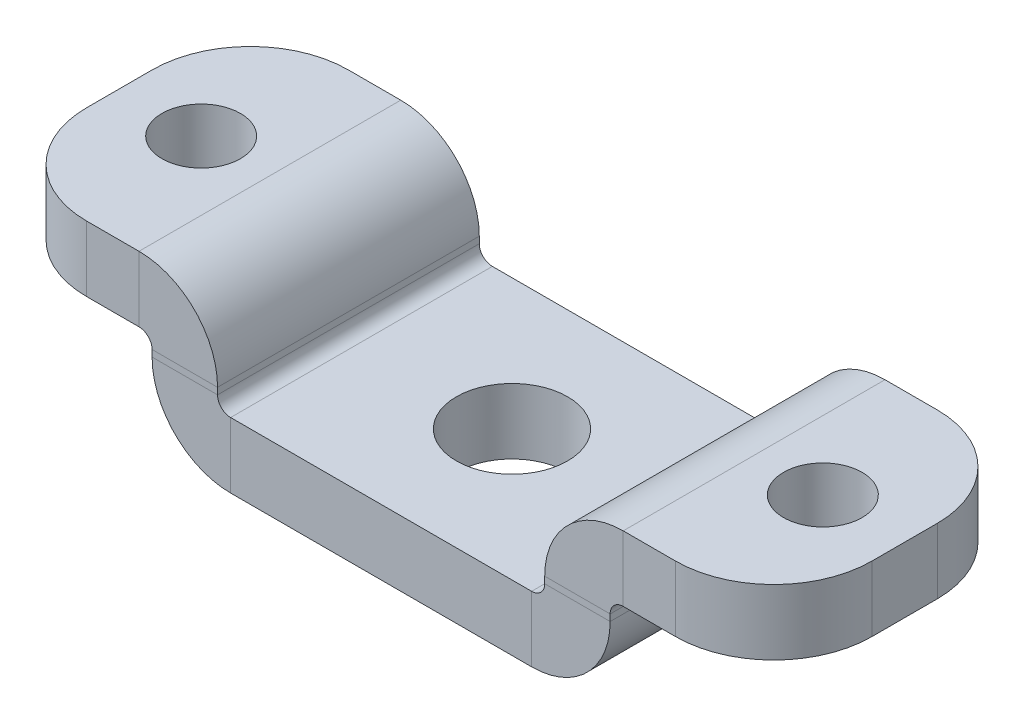
ISO-10303-21;
HEADER;
FILE_DESCRIPTION(('STEP AP214'),'2;1');
FILE_NAME('part.step','',(''),(''),'','','');
FILE_SCHEMA(('AUTOMOTIVE_DESIGN { 1 0 10303 214 1 1 1 1 }'));
ENDSEC;
DATA;
#1=APPLICATION_CONTEXT('core data for automotive mechanical design processes');
#2=APPLICATION_PROTOCOL_DEFINITION('international standard','automotive_design',2000,#1);
#3=PRODUCT_CONTEXT('',#1,'mechanical');
#4=PRODUCT('Part','Part','',(#3));
#5=PRODUCT_RELATED_PRODUCT_CATEGORY('part','',(#4));
#6=PRODUCT_DEFINITION_FORMATION('','',#4);
#7=PRODUCT_DEFINITION_CONTEXT('part definition',#1,'design');
#8=PRODUCT_DEFINITION('design','',#6,#7);
#9=PRODUCT_DEFINITION_SHAPE('','',#8);
#10=(LENGTH_UNIT() NAMED_UNIT(*) SI_UNIT(.MILLI.,.METRE.));
#11=(NAMED_UNIT(*) PLANE_ANGLE_UNIT() SI_UNIT($,.RADIAN.));
#12=(NAMED_UNIT(*) SI_UNIT($,.STERADIAN.) SOLID_ANGLE_UNIT());
#13=UNCERTAINTY_MEASURE_WITH_UNIT(LENGTH_MEASURE(1.E-05),#10,'distance_accuracy_value','');
#14=(GEOMETRIC_REPRESENTATION_CONTEXT(3) GLOBAL_UNCERTAINTY_ASSIGNED_CONTEXT((#13)) GLOBAL_UNIT_ASSIGNED_CONTEXT((#10,
#11,#12)) REPRESENTATION_CONTEXT('',''));
#15=CARTESIAN_POINT('',(0.,0.,0.));
#16=DIRECTION('',(0.,0.,1.));
#17=DIRECTION('',(1.,0.,0.));
#18=AXIS2_PLACEMENT_3D('',#15,#16,#17);
#19=CARTESIAN_POINT('',(7.,0.999999999999993,4.));
#20=DIRECTION('',(0.,0.,-1.));
#21=DIRECTION('',(-1.,0.,0.));
#22=AXIS2_PLACEMENT_3D('',#19,#20,#21);
#23=PLANE('',#22);
#24=DIRECTION('',(-1.,0.,0.));
#25=VECTOR('',#24,1.);
#26=CARTESIAN_POINT('',(7.,1.6,4.));
#27=LINE('',#26,#25);
#28=CARTESIAN_POINT('',(7.,1.6,4.));
#29=VERTEX_POINT('',#28);
#30=CARTESIAN_POINT('',(5.,1.60000000000001,4.));
#31=VERTEX_POINT('',#30);
#32=EDGE_CURVE('E340',#29,#31,#27,.T.);
#33=ORIENTED_EDGE('',*,*,#32,.T.);
#34=DIRECTION('',(0.,1.,0.));
#35=VECTOR('',#34,1.);
#36=CARTESIAN_POINT('',(5.,1.,4.));
#37=LINE('',#36,#35);
#38=CARTESIAN_POINT('',(5.,1.4,4.));
#39=VERTEX_POINT('',#38);
#40=EDGE_CURVE('E408',#31,#39,#37,.F.);
#41=ORIENTED_EDGE('',*,*,#40,.T.);
#42=DIRECTION('',(-1.,0.,0.));
#43=VECTOR('',#42,1.);
#44=CARTESIAN_POINT('',(7.,1.39999999999999,4.));
#45=LINE('',#44,#43);
#46=CARTESIAN_POINT('',(7.,1.39999999999999,4.));
#47=VERTEX_POINT('',#46);
#48=EDGE_CURVE('E396',#39,#47,#45,.F.);
#49=ORIENTED_EDGE('',*,*,#48,.T.);
#50=DIRECTION('',(0.,-1.,0.));
#51=VECTOR('',#50,1.);
#52=CARTESIAN_POINT('',(7.,0.,4.));
#53=LINE('',#52,#51);
#54=EDGE_CURVE('E403',#29,#47,#53,.T.);
#55=ORIENTED_EDGE('',*,*,#54,.F.);
#56=EDGE_LOOP('',(#33,#41,#49,#55));
#57=FACE_BOUND('',#56,.T.);
#58=ADVANCED_FACE('F121',(#57),#23,.F.);
#59=CARTESIAN_POINT('',(7.00000000000001,4.,-4.));
#60=DIRECTION('',(0.,0.,1.));
#61=DIRECTION('',(1.,0.,0.));
#62=AXIS2_PLACEMENT_3D('',#59,#60,#61);
#63=PLANE('',#62);
#64=DIRECTION('',(-1.,0.,0.));
#65=VECTOR('',#64,1.);
#66=CARTESIAN_POINT('',(7.,1.6,-4.));
#67=LINE('',#66,#65);
#68=CARTESIAN_POINT('',(7.,1.6,-4.));
#69=VERTEX_POINT('',#68);
#70=CARTESIAN_POINT('',(5.,1.6,-4.));
#71=VERTEX_POINT('',#70);
#72=EDGE_CURVE('E347',#69,#71,#67,.T.);
#73=ORIENTED_EDGE('',*,*,#72,.F.);
#74=DIRECTION('',(0.,1.,0.));
#75=VECTOR('',#74,1.);
#76=CARTESIAN_POINT('',(7.,0.,-4.));
#77=LINE('',#76,#75);
#78=CARTESIAN_POINT('',(7.,1.39999999999999,-4.));
#79=VERTEX_POINT('',#78);
#80=EDGE_CURVE('E399',#79,#69,#77,.T.);
#81=ORIENTED_EDGE('',*,*,#80,.F.);
#82=DIRECTION('',(-1.,0.,0.));
#83=VECTOR('',#82,1.);
#84=CARTESIAN_POINT('',(5.,1.4,-4.));
#85=LINE('',#84,#83);
#86=CARTESIAN_POINT('',(5.,1.4,-4.));
#87=VERTEX_POINT('',#86);
#88=EDGE_CURVE('E413',#87,#79,#85,.F.);
#89=ORIENTED_EDGE('',*,*,#88,.F.);
#90=DIRECTION('',(0.,-1.,0.));
#91=VECTOR('',#90,1.);
#92=CARTESIAN_POINT('',(5.00000000000001,4.00000000000001,-4.));
#93=LINE('',#92,#91);
#94=EDGE_CURVE('E405',#87,#71,#93,.F.);
#95=ORIENTED_EDGE('',*,*,#94,.T.);
#96=EDGE_LOOP('',(#73,#81,#89,#95));
#97=FACE_BOUND('',#96,.T.);
#98=ADVANCED_FACE('F611',(#97),#63,.F.);
#99=CARTESIAN_POINT('',(7.,0.,0.));
#100=DIRECTION('',(-1.,0.,0.));
#101=DIRECTION('',(0.,-1.,0.));
#102=AXIS2_PLACEMENT_3D('',#99,#100,#101);
#103=PLANE('',#102);
#104=DIRECTION('',(0.,0.,1.));
#105=VECTOR('',#104,1.);
#106=CARTESIAN_POINT('',(7.,1.6,4.));
#107=LINE('',#106,#105);
#108=EDGE_CURVE('E344',#29,#69,#107,.F.);
#109=ORIENTED_EDGE('',*,*,#108,.F.);
#110=ORIENTED_EDGE('',*,*,#54,.T.);
#111=DIRECTION('',(0.,0.,-1.));
#112=VECTOR('',#111,1.);
#113=CARTESIAN_POINT('',(7.,1.39999999999999,4.));
#114=LINE('',#113,#112);
#115=EDGE_CURVE('E410',#79,#47,#114,.F.);
#116=ORIENTED_EDGE('',*,*,#115,.F.);
#117=ORIENTED_EDGE('',*,*,#80,.T.);
#118=EDGE_LOOP('',(#109,#110,#116,#117));
#119=FACE_BOUND('',#118,.T.);
#120=ADVANCED_FACE('F608',(#119),#103,.F.);
#121=CARTESIAN_POINT('',(5.,0.,0.));
#122=DIRECTION('',(-1.,0.,0.));
#123=DIRECTION('',(0.,-1.,0.));
#124=AXIS2_PLACEMENT_3D('',#121,#122,#123);
#125=PLANE('',#124);
#126=ORIENTED_EDGE('',*,*,#40,.F.);
#127=DIRECTION('',(0.,0.,1.));
#128=VECTOR('',#127,1.);
#129=CARTESIAN_POINT('',(5.,1.60000000000001,4.));
#130=LINE('',#129,#128);
#131=EDGE_CURVE('E292',#31,#71,#130,.F.);
#132=ORIENTED_EDGE('',*,*,#131,.T.);
#133=ORIENTED_EDGE('',*,*,#94,.F.);
#134=DIRECTION('',(0.,0.,-1.));
#135=VECTOR('',#134,1.);
#136=CARTESIAN_POINT('',(5.,1.4,4.));
#137=LINE('',#136,#135);
#138=EDGE_CURVE('E416',#39,#87,#137,.T.);
#139=ORIENTED_EDGE('',*,*,#138,.F.);
#140=EDGE_LOOP('',(#126,#132,#133,#139));
#141=FACE_BOUND('',#140,.T.);
#142=ADVANCED_FACE('F618',(#141),#125,.T.);
#143=CARTESIAN_POINT('',(-7.,0.999999999999993,-4.));
#144=DIRECTION('',(0.,0.,1.));
#145=DIRECTION('',(0.,-1.,0.));
#146=AXIS2_PLACEMENT_3D('',#143,#144,#145);
#147=PLANE('',#146);
#148=DIRECTION('',(1.,0.,0.));
#149=VECTOR('',#148,1.);
#150=CARTESIAN_POINT('',(-7.,1.6,-4.));
#151=LINE('',#150,#149);
#152=CARTESIAN_POINT('',(-7.,1.6,-4.));
#153=VERTEX_POINT('',#152);
#154=CARTESIAN_POINT('',(-5.,1.60000000000001,-4.));
#155=VERTEX_POINT('',#154);
#156=EDGE_CURVE('E383',#153,#155,#151,.T.);
#157=ORIENTED_EDGE('',*,*,#156,.T.);
#158=DIRECTION('',(0.,1.,0.));
#159=VECTOR('',#158,1.);
#160=CARTESIAN_POINT('',(-5.,1.,-4.));
#161=LINE('',#160,#159);
#162=CARTESIAN_POINT('',(-5.,1.4,-4.));
#163=VERTEX_POINT('',#162);
#164=EDGE_CURVE('E452',#155,#163,#161,.F.);
#165=ORIENTED_EDGE('',*,*,#164,.T.);
#166=DIRECTION('',(1.,0.,0.));
#167=VECTOR('',#166,1.);
#168=CARTESIAN_POINT('',(-7.,1.39999999999999,-4.));
#169=LINE('',#168,#167);
#170=CARTESIAN_POINT('',(-7.,1.39999999999999,-4.));
#171=VERTEX_POINT('',#170);
#172=EDGE_CURVE('E440',#163,#171,#169,.F.);
#173=ORIENTED_EDGE('',*,*,#172,.T.);
#174=DIRECTION('',(0.,-1.,0.));
#175=VECTOR('',#174,1.);
#176=CARTESIAN_POINT('',(-7.,0.,-4.));
#177=LINE('',#176,#175);
#178=EDGE_CURVE('E447',#153,#171,#177,.T.);
#179=ORIENTED_EDGE('',*,*,#178,.F.);
#180=EDGE_LOOP('',(#157,#165,#173,#179));
#181=FACE_BOUND('',#180,.T.);
#182=ADVANCED_FACE('F577',(#181),#147,.F.);
#183=CARTESIAN_POINT('',(-7.00000000000001,4.,4.));
#184=DIRECTION('',(0.,0.,-1.));
#185=DIRECTION('',(0.,1.,0.));
#186=AXIS2_PLACEMENT_3D('',#183,#184,#185);
#187=PLANE('',#186);
#188=DIRECTION('',(1.,0.,0.));
#189=VECTOR('',#188,1.);
#190=CARTESIAN_POINT('',(-7.,1.6,4.));
#191=LINE('',#190,#189);
#192=CARTESIAN_POINT('',(-7.,1.6,4.));
#193=VERTEX_POINT('',#192);
#194=CARTESIAN_POINT('',(-5.,1.6,4.));
#195=VERTEX_POINT('',#194);
#196=EDGE_CURVE('E393',#193,#195,#191,.T.);
#197=ORIENTED_EDGE('',*,*,#196,.F.);
#198=DIRECTION('',(0.,1.,0.));
#199=VECTOR('',#198,1.);
#200=CARTESIAN_POINT('',(-6.99999999999999,0.,4.));
#201=LINE('',#200,#199);
#202=CARTESIAN_POINT('',(-7.,1.39999999999999,4.));
#203=VERTEX_POINT('',#202);
#204=EDGE_CURVE('E443',#203,#193,#201,.T.);
#205=ORIENTED_EDGE('',*,*,#204,.F.);
#206=DIRECTION('',(1.,0.,0.));
#207=VECTOR('',#206,1.);
#208=CARTESIAN_POINT('',(-5.,1.4,4.));
#209=LINE('',#208,#207);
#210=CARTESIAN_POINT('',(-5.,1.4,4.));
#211=VERTEX_POINT('',#210);
#212=EDGE_CURVE('E457',#211,#203,#209,.F.);
#213=ORIENTED_EDGE('',*,*,#212,.F.);
#214=DIRECTION('',(0.,-1.,0.));
#215=VECTOR('',#214,1.);
#216=CARTESIAN_POINT('',(-5.00000000000001,4.00000000000001,4.));
#217=LINE('',#216,#215);
#218=EDGE_CURVE('E449',#211,#195,#217,.F.);
#219=ORIENTED_EDGE('',*,*,#218,.T.);
#220=EDGE_LOOP('',(#197,#205,#213,#219));
#221=FACE_BOUND('',#220,.T.);
#222=ADVANCED_FACE('F560',(#221),#187,.F.);
#223=CARTESIAN_POINT('',(-7.,0.,0.));
#224=DIRECTION('',(1.,0.,0.));
#225=DIRECTION('',(0.,1.,0.));
#226=AXIS2_PLACEMENT_3D('',#223,#224,#225);
#227=PLANE('',#226);
#228=DIRECTION('',(0.,0.,-1.));
#229=VECTOR('',#228,1.);
#230=CARTESIAN_POINT('',(-7.,1.6,-4.));
#231=LINE('',#230,#229);
#232=EDGE_CURVE('E389',#153,#193,#231,.F.);
#233=ORIENTED_EDGE('',*,*,#232,.F.);
#234=ORIENTED_EDGE('',*,*,#178,.T.);
#235=DIRECTION('',(0.,0.,1.));
#236=VECTOR('',#235,1.);
#237=CARTESIAN_POINT('',(-7.,1.39999999999999,-4.));
#238=LINE('',#237,#236);
#239=EDGE_CURVE('E454',#203,#171,#238,.F.);
#240=ORIENTED_EDGE('',*,*,#239,.F.);
#241=ORIENTED_EDGE('',*,*,#204,.T.);
#242=EDGE_LOOP('',(#233,#234,#240,#241));
#243=FACE_BOUND('',#242,.T.);
#244=ADVANCED_FACE('F565',(#243),#227,.F.);
#245=CARTESIAN_POINT('',(-5.,0.,0.));
#246=DIRECTION('',(1.,0.,0.));
#247=DIRECTION('',(0.,1.,0.));
#248=AXIS2_PLACEMENT_3D('',#245,#246,#247);
#249=PLANE('',#248);
#250=ORIENTED_EDGE('',*,*,#164,.F.);
#251=DIRECTION('',(0.,0.,-1.));
#252=VECTOR('',#251,1.);
#253=CARTESIAN_POINT('',(-5.,1.60000000000001,-4.));
#254=LINE('',#253,#252);
#255=EDGE_CURVE('E376',#155,#195,#254,.F.);
#256=ORIENTED_EDGE('',*,*,#255,.T.);
#257=ORIENTED_EDGE('',*,*,#218,.F.);
#258=DIRECTION('',(0.,0.,1.));
#259=VECTOR('',#258,1.);
#260=CARTESIAN_POINT('',(-5.,1.4,-4.));
#261=LINE('',#260,#259);
#262=EDGE_CURVE('E460',#163,#211,#261,.T.);
#263=ORIENTED_EDGE('',*,*,#262,.F.);
#264=EDGE_LOOP('',(#250,#256,#257,#263));
#265=FACE_BOUND('',#264,.T.);
#266=ADVANCED_FACE('F581',(#265),#249,.T.);
#267=CARTESIAN_POINT('',(0.,-1.,0.));
#268=DIRECTION('',(0.,1.,0.));
#269=DIRECTION('',(0.,0.,1.));
#270=AXIS2_PLACEMENT_3D('',#267,#268,#269);
#271=PLANE('',#270);
#272=CARTESIAN_POINT('',(0.,-1.,0.));
#273=DIRECTION('',(0.,-1.,0.));
#274=DIRECTION('',(0.,0.,-1.));
#275=AXIS2_PLACEMENT_3D('',#272,#273,#274);
#276=CIRCLE('',#275,1.69999999999999);
#277=CARTESIAN_POINT('',(0.,-1.,-1.69999999999999));
#278=VERTEX_POINT('',#277);
#279=EDGE_CURVE('E680',#278,#278,#276,.T.);
#280=ORIENTED_EDGE('',*,*,#279,.F.);
#281=EDGE_LOOP('',(#280));
#282=FACE_BOUND('',#281,.T.);
#283=DIRECTION('',(0.,0.,-1.));
#284=VECTOR('',#283,1.);
#285=CARTESIAN_POINT('',(4.6,-1.,-4.));
#286=LINE('',#285,#284);
#287=CARTESIAN_POINT('',(4.6,-1.,-4.));
#288=VERTEX_POINT('',#287);
#289=CARTESIAN_POINT('',(4.6,-1.,4.));
#290=VERTEX_POINT('',#289);
#291=EDGE_CURVE('E420',#288,#290,#286,.F.);
#292=ORIENTED_EDGE('',*,*,#291,.T.);
#293=DIRECTION('',(1.,0.,0.));
#294=VECTOR('',#293,1.);
#295=CARTESIAN_POINT('',(-7.,-1.,4.));
#296=LINE('',#295,#294);
#297=CARTESIAN_POINT('',(-4.59999999999999,-1.,4.));
#298=VERTEX_POINT('',#297);
#299=EDGE_CURVE('E490',#298,#290,#296,.T.);
#300=ORIENTED_EDGE('',*,*,#299,.F.);
#301=DIRECTION('',(0.,0.,1.));
#302=VECTOR('',#301,1.);
#303=CARTESIAN_POINT('',(-4.59999999999999,-1.,4.));
#304=LINE('',#303,#302);
#305=CARTESIAN_POINT('',(-4.6,-1.,-4.));
#306=VERTEX_POINT('',#305);
#307=EDGE_CURVE('E464',#298,#306,#304,.F.);
#308=ORIENTED_EDGE('',*,*,#307,.T.);
#309=DIRECTION('',(-1.,0.,0.));
#310=VECTOR('',#309,1.);
#311=CARTESIAN_POINT('',(-7.,-1.,-4.));
#312=LINE('',#311,#310);
#313=EDGE_CURVE('E488',#288,#306,#312,.T.);
#314=ORIENTED_EDGE('',*,*,#313,.F.);
#315=EDGE_LOOP('',(#292,#300,#308,#314));
#316=FACE_BOUND('',#315,.T.);
#317=ADVANCED_FACE('F592',(#282,#316),#271,.F.);
#318=CARTESIAN_POINT('',(0.,1.,0.));
#319=DIRECTION('',(0.,1.,0.));
#320=DIRECTION('',(0.,0.,1.));
#321=AXIS2_PLACEMENT_3D('',#318,#319,#320);
#322=PLANE('',#321);
#323=CARTESIAN_POINT('',(0.,1.,0.));
#324=DIRECTION('',(0.,1.,0.));
#325=DIRECTION('',(0.,0.,1.));
#326=AXIS2_PLACEMENT_3D('',#323,#324,#325);
#327=CIRCLE('',#326,1.69999999999999);
#328=CARTESIAN_POINT('',(0.,1.,1.69999999999999));
#329=VERTEX_POINT('',#328);
#330=EDGE_CURVE('E337',#329,#329,#327,.T.);
#331=ORIENTED_EDGE('',*,*,#330,.F.);
#332=EDGE_LOOP('',(#331));
#333=FACE_BOUND('',#332,.T.);
#334=DIRECTION('',(1.,0.,0.));
#335=VECTOR('',#334,1.);
#336=CARTESIAN_POINT('',(-7.,1.,4.));
#337=LINE('',#336,#335);
#338=CARTESIAN_POINT('',(-4.6,1.,4.));
#339=VERTEX_POINT('',#338);
#340=CARTESIAN_POINT('',(4.6,0.999999999999999,4.));
#341=VERTEX_POINT('',#340);
#342=EDGE_CURVE('E491',#339,#341,#337,.T.);
#343=ORIENTED_EDGE('',*,*,#342,.T.);
#344=DIRECTION('',(0.,0.,-1.));
#345=VECTOR('',#344,1.);
#346=CARTESIAN_POINT('',(4.6,0.999999999999997,-4.));
#347=LINE('',#346,#345);
#348=CARTESIAN_POINT('',(4.6,0.999999999999997,-4.));
#349=VERTEX_POINT('',#348);
#350=EDGE_CURVE('E432',#349,#341,#347,.F.);
#351=ORIENTED_EDGE('',*,*,#350,.F.);
#352=DIRECTION('',(-1.,0.,0.));
#353=VECTOR('',#352,1.);
#354=CARTESIAN_POINT('',(-7.,1.,-4.));
#355=LINE('',#354,#353);
#356=CARTESIAN_POINT('',(-4.6,1.,-4.));
#357=VERTEX_POINT('',#356);
#358=EDGE_CURVE('E485',#349,#357,#355,.T.);
#359=ORIENTED_EDGE('',*,*,#358,.T.);
#360=DIRECTION('',(0.,0.,1.));
#361=VECTOR('',#360,1.);
#362=CARTESIAN_POINT('',(-4.6,0.999999999999998,4.));
#363=LINE('',#362,#361);
#364=EDGE_CURVE('E477',#339,#357,#363,.F.);
#365=ORIENTED_EDGE('',*,*,#364,.F.);
#366=EDGE_LOOP('',(#343,#351,#359,#365));
#367=FACE_BOUND('',#366,.T.);
#368=ADVANCED_FACE('F629',(#333,#367),#322,.T.);
#369=CARTESIAN_POINT('',(-7.,-1.,-4.));
#370=DIRECTION('',(0.,0.,-1.));
#371=DIRECTION('',(-1.,0.,0.));
#372=AXIS2_PLACEMENT_3D('',#369,#370,#371);
#373=PLANE('',#372);
#374=ORIENTED_EDGE('',*,*,#358,.F.);
#375=DIRECTION('',(0.,-1.,0.));
#376=VECTOR('',#375,1.);
#377=CARTESIAN_POINT('',(4.6,0.999999999999997,-4.));
#378=LINE('',#377,#376);
#379=EDGE_CURVE('E426',#349,#288,#378,.T.);
#380=ORIENTED_EDGE('',*,*,#379,.T.);
#381=ORIENTED_EDGE('',*,*,#313,.T.);
#382=DIRECTION('',(0.,-1.,0.));
#383=VECTOR('',#382,1.);
#384=CARTESIAN_POINT('',(-4.6,1.,-4.));
#385=LINE('',#384,#383);
#386=EDGE_CURVE('E482',#357,#306,#385,.T.);
#387=ORIENTED_EDGE('',*,*,#386,.F.);
#388=EDGE_LOOP('',(#374,#380,#381,#387));
#389=FACE_BOUND('',#388,.T.);
#390=ADVANCED_FACE('F631',(#389),#373,.T.);
#391=CARTESIAN_POINT('',(-7.,-1.,4.));
#392=DIRECTION('',(0.,0.,1.));
#393=DIRECTION('',(1.,0.,0.));
#394=AXIS2_PLACEMENT_3D('',#391,#392,#393);
#395=PLANE('',#394);
#396=DIRECTION('',(0.,-1.,0.));
#397=VECTOR('',#396,1.);
#398=CARTESIAN_POINT('',(4.6,0.999999999999999,4.));
#399=LINE('',#398,#397);
#400=EDGE_CURVE('E437',#341,#290,#399,.T.);
#401=ORIENTED_EDGE('',*,*,#400,.F.);
#402=ORIENTED_EDGE('',*,*,#342,.F.);
#403=DIRECTION('',(0.,-1.,0.));
#404=VECTOR('',#403,1.);
#405=CARTESIAN_POINT('',(-4.6,0.999999999999998,4.));
#406=LINE('',#405,#404);
#407=EDGE_CURVE('E471',#339,#298,#406,.T.);
#408=ORIENTED_EDGE('',*,*,#407,.T.);
#409=ORIENTED_EDGE('',*,*,#299,.T.);
#410=EDGE_LOOP('',(#401,#402,#408,#409));
#411=FACE_BOUND('',#410,.T.);
#412=ADVANCED_FACE('F590',(#411),#395,.T.);
#413=CARTESIAN_POINT('',(-4.6,1.4,-4.));
#414=DIRECTION('',(0.,0.,-1.));
#415=DIRECTION('',(0.,1.,0.));
#416=AXIS2_PLACEMENT_3D('',#413,#414,#415);
#417=PLANE('',#416);
#418=ORIENTED_EDGE('',*,*,#172,.F.);
#419=CARTESIAN_POINT('',(-4.6,1.4,-4.));
#420=DIRECTION('',(0.,0.,1.));
#421=DIRECTION('',(0.,-1.,0.));
#422=AXIS2_PLACEMENT_3D('',#419,#420,#421);
#423=CIRCLE('',#422,0.400000000000001);
#424=EDGE_CURVE('E474',#357,#163,#423,.F.);
#425=ORIENTED_EDGE('',*,*,#424,.F.);
#426=ORIENTED_EDGE('',*,*,#386,.T.);
#427=CARTESIAN_POINT('',(-4.6,1.4,-4.));
#428=DIRECTION('',(0.,0.,1.));
#429=DIRECTION('',(0.,-1.,0.));
#430=AXIS2_PLACEMENT_3D('',#427,#428,#429);
#431=CIRCLE('',#430,2.4);
#432=EDGE_CURVE('E467',#306,#171,#431,.F.);
#433=ORIENTED_EDGE('',*,*,#432,.T.);
#434=EDGE_LOOP('',(#418,#425,#426,#433));
#435=FACE_BOUND('',#434,.T.);
#436=ADVANCED_FACE('F573',(#435),#417,.T.);
#437=CARTESIAN_POINT('',(-4.6,1.4,4.));
#438=DIRECTION('',(0.,0.,-1.));
#439=DIRECTION('',(0.,1.,0.));
#440=AXIS2_PLACEMENT_3D('',#437,#438,#439);
#441=PLANE('',#440);
#442=CARTESIAN_POINT('',(-4.6,1.4,4.));
#443=DIRECTION('',(0.,0.,1.));
#444=DIRECTION('',(0.,-1.,0.));
#445=AXIS2_PLACEMENT_3D('',#442,#443,#444);
#446=CIRCLE('',#445,0.400000000000001);
#447=EDGE_CURVE('E446',#211,#339,#446,.T.);
#448=ORIENTED_EDGE('',*,*,#447,.F.);
#449=ORIENTED_EDGE('',*,*,#212,.T.);
#450=CARTESIAN_POINT('',(-4.6,1.4,4.));
#451=DIRECTION('',(0.,0.,1.));
#452=DIRECTION('',(0.,-1.,0.));
#453=AXIS2_PLACEMENT_3D('',#450,#451,#452);
#454=CIRCLE('',#453,2.4);
#455=EDGE_CURVE('E468',#203,#298,#454,.T.);
#456=ORIENTED_EDGE('',*,*,#455,.T.);
#457=ORIENTED_EDGE('',*,*,#407,.F.);
#458=EDGE_LOOP('',(#448,#449,#456,#457));
#459=FACE_BOUND('',#458,.T.);
#460=ADVANCED_FACE('F587',(#459),#441,.F.);
#461=CARTESIAN_POINT('',(-4.6,1.4,4.));
#462=DIRECTION('',(0.,0.,1.));
#463=DIRECTION('',(-1.,0.,0.));
#464=AXIS2_PLACEMENT_3D('',#461,#462,#463);
#465=CYLINDRICAL_SURFACE('',#464,2.4);
#466=ORIENTED_EDGE('',*,*,#307,.F.);
#467=ORIENTED_EDGE('',*,*,#455,.F.);
#468=ORIENTED_EDGE('',*,*,#239,.T.);
#469=ORIENTED_EDGE('',*,*,#432,.F.);
#470=EDGE_LOOP('',(#466,#467,#468,#469));
#471=FACE_BOUND('',#470,.T.);
#472=ADVANCED_FACE('F570',(#471),#465,.T.);
#473=CARTESIAN_POINT('',(-4.6,1.4,4.));
#474=DIRECTION('',(0.,0.,1.));
#475=DIRECTION('',(-1.,0.,0.));
#476=AXIS2_PLACEMENT_3D('',#473,#474,#475);
#477=CYLINDRICAL_SURFACE('',#476,0.400000000000001);
#478=ORIENTED_EDGE('',*,*,#364,.T.);
#479=ORIENTED_EDGE('',*,*,#424,.T.);
#480=ORIENTED_EDGE('',*,*,#262,.T.);
#481=ORIENTED_EDGE('',*,*,#447,.T.);
#482=EDGE_LOOP('',(#478,#479,#480,#481));
#483=FACE_BOUND('',#482,.T.);
#484=ADVANCED_FACE('F584',(#483),#477,.F.);
#485=CARTESIAN_POINT('',(4.6,1.4,4.));
#486=DIRECTION('',(0.,0.,1.));
#487=DIRECTION('',(0.,-1.,0.));
#488=AXIS2_PLACEMENT_3D('',#485,#486,#487);
#489=PLANE('',#488);
#490=ORIENTED_EDGE('',*,*,#48,.F.);
#491=CARTESIAN_POINT('',(4.6,1.4,4.));
#492=DIRECTION('',(0.,0.,-1.));
#493=DIRECTION('',(0.,1.,0.));
#494=AXIS2_PLACEMENT_3D('',#491,#492,#493);
#495=CIRCLE('',#494,0.400000000000001);
#496=EDGE_CURVE('E429',#341,#39,#495,.F.);
#497=ORIENTED_EDGE('',*,*,#496,.F.);
#498=ORIENTED_EDGE('',*,*,#400,.T.);
#499=CARTESIAN_POINT('',(4.6,1.4,4.));
#500=DIRECTION('',(0.,0.,-1.));
#501=DIRECTION('',(0.,1.,0.));
#502=AXIS2_PLACEMENT_3D('',#499,#500,#501);
#503=CIRCLE('',#502,2.4);
#504=EDGE_CURVE('E422',#290,#47,#503,.F.);
#505=ORIENTED_EDGE('',*,*,#504,.T.);
#506=EDGE_LOOP('',(#490,#497,#498,#505));
#507=FACE_BOUND('',#506,.T.);
#508=ADVANCED_FACE('F624',(#507),#489,.T.);
#509=CARTESIAN_POINT('',(4.6,1.4,-4.));
#510=DIRECTION('',(0.,0.,1.));
#511=DIRECTION('',(0.,-1.,0.));
#512=AXIS2_PLACEMENT_3D('',#509,#510,#511);
#513=PLANE('',#512);
#514=CARTESIAN_POINT('',(4.6,1.4,-4.));
#515=DIRECTION('',(0.,0.,-1.));
#516=DIRECTION('',(0.,1.,0.));
#517=AXIS2_PLACEMENT_3D('',#514,#515,#516);
#518=CIRCLE('',#517,0.400000000000001);
#519=EDGE_CURVE('E402',#87,#349,#518,.T.);
#520=ORIENTED_EDGE('',*,*,#519,.F.);
#521=ORIENTED_EDGE('',*,*,#88,.T.);
#522=CARTESIAN_POINT('',(4.6,1.4,-4.));
#523=DIRECTION('',(0.,0.,-1.));
#524=DIRECTION('',(0.,1.,0.));
#525=AXIS2_PLACEMENT_3D('',#522,#523,#524);
#526=CIRCLE('',#525,2.4);
#527=EDGE_CURVE('E423',#79,#288,#526,.T.);
#528=ORIENTED_EDGE('',*,*,#527,.T.);
#529=ORIENTED_EDGE('',*,*,#379,.F.);
#530=EDGE_LOOP('',(#520,#521,#528,#529));
#531=FACE_BOUND('',#530,.T.);
#532=ADVANCED_FACE('F600',(#531),#513,.F.);
#533=CARTESIAN_POINT('',(4.6,1.4,-4.));
#534=DIRECTION('',(0.,0.,-1.));
#535=DIRECTION('',(1.,0.,0.));
#536=AXIS2_PLACEMENT_3D('',#533,#534,#535);
#537=CYLINDRICAL_SURFACE('',#536,2.4);
#538=ORIENTED_EDGE('',*,*,#291,.F.);
#539=ORIENTED_EDGE('',*,*,#527,.F.);
#540=ORIENTED_EDGE('',*,*,#115,.T.);
#541=ORIENTED_EDGE('',*,*,#504,.F.);
#542=EDGE_LOOP('',(#538,#539,#540,#541));
#543=FACE_BOUND('',#542,.T.);
#544=ADVANCED_FACE('F596',(#543),#537,.T.);
#545=CARTESIAN_POINT('',(4.6,1.4,-4.));
#546=DIRECTION('',(0.,0.,-1.));
#547=DIRECTION('',(1.,0.,0.));
#548=AXIS2_PLACEMENT_3D('',#545,#546,#547);
#549=CYLINDRICAL_SURFACE('',#548,0.400000000000001);
#550=ORIENTED_EDGE('',*,*,#350,.T.);
#551=ORIENTED_EDGE('',*,*,#496,.T.);
#552=ORIENTED_EDGE('',*,*,#138,.T.);
#553=ORIENTED_EDGE('',*,*,#519,.T.);
#554=EDGE_LOOP('',(#550,#551,#552,#553));
#555=FACE_BOUND('',#554,.T.);
#556=ADVANCED_FACE('F626',(#555),#549,.F.);
#557=CARTESIAN_POINT('',(-7.4,1.6,4.));
#558=DIRECTION('',(0.,0.,1.));
#559=DIRECTION('',(1.,0.,0.));
#560=AXIS2_PLACEMENT_3D('',#557,#558,#559);
#561=PLANE('',#560);
#562=DIRECTION('',(0.,-1.,0.));
#563=VECTOR('',#562,1.);
#564=CARTESIAN_POINT('',(-7.4,4.,4.));
#565=LINE('',#564,#563);
#566=CARTESIAN_POINT('',(-7.4,2.,4.));
#567=VERTEX_POINT('',#566);
#568=CARTESIAN_POINT('',(-7.4,4.,4.));
#569=VERTEX_POINT('',#568);
#570=EDGE_CURVE('E350',#567,#569,#565,.F.);
#571=ORIENTED_EDGE('',*,*,#570,.F.);
#572=CARTESIAN_POINT('',(-7.4,1.6,4.));
#573=DIRECTION('',(0.,0.,-1.));
#574=DIRECTION('',(-1.,0.,0.));
#575=AXIS2_PLACEMENT_3D('',#572,#573,#574);
#576=CIRCLE('',#575,0.4);
#577=EDGE_CURVE('E386',#193,#567,#576,.F.);
#578=ORIENTED_EDGE('',*,*,#577,.F.);
#579=ORIENTED_EDGE('',*,*,#196,.T.);
#580=CARTESIAN_POINT('',(-7.4,1.6,4.));
#581=DIRECTION('',(0.,0.,-1.));
#582=DIRECTION('',(-1.,0.,0.));
#583=AXIS2_PLACEMENT_3D('',#580,#581,#582);
#584=CIRCLE('',#583,2.4);
#585=EDGE_CURVE('E379',#195,#569,#584,.F.);
#586=ORIENTED_EDGE('',*,*,#585,.T.);
#587=EDGE_LOOP('',(#571,#578,#579,#586));
#588=FACE_BOUND('',#587,.T.);
#589=ADVANCED_FACE('F548',(#588),#561,.T.);
#590=CARTESIAN_POINT('',(-7.4,1.6,-4.));
#591=DIRECTION('',(0.,0.,1.));
#592=DIRECTION('',(1.,0.,0.));
#593=AXIS2_PLACEMENT_3D('',#590,#591,#592);
#594=PLANE('',#593);
#595=CARTESIAN_POINT('',(-7.4,1.6,-4.));
#596=DIRECTION('',(0.,0.,-1.));
#597=DIRECTION('',(-1.,0.,0.));
#598=AXIS2_PLACEMENT_3D('',#595,#596,#597);
#599=CIRCLE('',#598,0.4);
#600=CARTESIAN_POINT('',(-7.4,2.,-4.));
#601=VERTEX_POINT('',#600);
#602=EDGE_CURVE('E354',#601,#153,#599,.T.);
#603=ORIENTED_EDGE('',*,*,#602,.F.);
#604=DIRECTION('',(0.,-1.,0.));
#605=VECTOR('',#604,1.);
#606=CARTESIAN_POINT('',(-7.4,2.,-4.));
#607=LINE('',#606,#605);
#608=CARTESIAN_POINT('',(-7.4,4.,-4.));
#609=VERTEX_POINT('',#608);
#610=EDGE_CURVE('E369',#601,#609,#607,.F.);
#611=ORIENTED_EDGE('',*,*,#610,.T.);
#612=CARTESIAN_POINT('',(-7.4,1.6,-4.));
#613=DIRECTION('',(0.,0.,-1.));
#614=DIRECTION('',(-1.,0.,0.));
#615=AXIS2_PLACEMENT_3D('',#612,#613,#614);
#616=CIRCLE('',#615,2.4);
#617=EDGE_CURVE('E380',#609,#155,#616,.T.);
#618=ORIENTED_EDGE('',*,*,#617,.T.);
#619=ORIENTED_EDGE('',*,*,#156,.F.);
#620=EDGE_LOOP('',(#603,#611,#618,#619));
#621=FACE_BOUND('',#620,.T.);
#622=ADVANCED_FACE('F543',(#621),#594,.F.);
#623=CARTESIAN_POINT('',(-7.4,1.6,-4.));
#624=DIRECTION('',(0.,0.,-1.));
#625=DIRECTION('',(0.,1.,0.));
#626=AXIS2_PLACEMENT_3D('',#623,#624,#625);
#627=CYLINDRICAL_SURFACE('',#626,2.4);
#628=ORIENTED_EDGE('',*,*,#255,.F.);
#629=ORIENTED_EDGE('',*,*,#617,.F.);
#630=DIRECTION('',(0.,0.,-1.));
#631=VECTOR('',#630,1.);
#632=CARTESIAN_POINT('',(-7.4,4.,4.));
#633=LINE('',#632,#631);
#634=EDGE_CURVE('E366',#609,#569,#633,.F.);
#635=ORIENTED_EDGE('',*,*,#634,.T.);
#636=ORIENTED_EDGE('',*,*,#585,.F.);
#637=EDGE_LOOP('',(#628,#629,#635,#636));
#638=FACE_BOUND('',#637,.T.);
#639=ADVANCED_FACE('F545',(#638),#627,.T.);
#640=CARTESIAN_POINT('',(-7.4,1.6,-4.));
#641=DIRECTION('',(0.,0.,-1.));
#642=DIRECTION('',(0.,1.,0.));
#643=AXIS2_PLACEMENT_3D('',#640,#641,#642);
#644=CYLINDRICAL_SURFACE('',#643,0.4);
#645=ORIENTED_EDGE('',*,*,#232,.T.);
#646=ORIENTED_EDGE('',*,*,#577,.T.);
#647=DIRECTION('',(0.,0.,-1.));
#648=VECTOR('',#647,1.);
#649=CARTESIAN_POINT('',(-7.4,2.,4.));
#650=LINE('',#649,#648);
#651=EDGE_CURVE('E372',#567,#601,#650,.T.);
#652=ORIENTED_EDGE('',*,*,#651,.T.);
#653=ORIENTED_EDGE('',*,*,#602,.T.);
#654=EDGE_LOOP('',(#645,#646,#652,#653));
#655=FACE_BOUND('',#654,.T.);
#656=ADVANCED_FACE('F556',(#655),#644,.F.);
#657=CARTESIAN_POINT('',(-12.,4.,-4.));
#658=DIRECTION('',(0.,0.,1.));
#659=DIRECTION('',(1.,0.,0.));
#660=AXIS2_PLACEMENT_3D('',#657,#658,#659);
#661=PLANE('',#660);
#662=DIRECTION('',(1.,0.,0.));
#663=VECTOR('',#662,1.);
#664=CARTESIAN_POINT('',(-12.,2.,-4.));
#665=LINE('',#664,#663);
#666=CARTESIAN_POINT('',(-9.00000000000001,2.,-4.));
#667=VERTEX_POINT('',#666);
#668=EDGE_CURVE('E364',#601,#667,#665,.F.);
#669=ORIENTED_EDGE('',*,*,#668,.T.);
#670=DIRECTION('',(0.,-1.,0.));
#671=VECTOR('',#670,1.);
#672=CARTESIAN_POINT('',(-9.00000000000001,4.,-4.));
#673=LINE('',#672,#671);
#674=CARTESIAN_POINT('',(-9.00000000000001,4.,-4.));
#675=VERTEX_POINT('',#674);
#676=EDGE_CURVE('E144',#667,#675,#673,.F.);
#677=ORIENTED_EDGE('',*,*,#676,.T.);
#678=DIRECTION('',(-1.,0.,0.));
#679=VECTOR('',#678,1.);
#680=CARTESIAN_POINT('',(0.,4.,-4.));
#681=LINE('',#680,#679);
#682=EDGE_CURVE('E357',#609,#675,#681,.T.);
#683=ORIENTED_EDGE('',*,*,#682,.F.);
#684=ORIENTED_EDGE('',*,*,#610,.F.);
#685=EDGE_LOOP('',(#669,#677,#683,#684));
#686=FACE_BOUND('',#685,.T.);
#687=ADVANCED_FACE('F540',(#686),#661,.F.);
#688=CARTESIAN_POINT('',(-7.,4.,4.));
#689=DIRECTION('',(0.,0.,-1.));
#690=DIRECTION('',(-1.,0.,0.));
#691=AXIS2_PLACEMENT_3D('',#688,#689,#690);
#692=PLANE('',#691);
#693=DIRECTION('',(1.,0.,0.));
#694=VECTOR('',#693,1.);
#695=CARTESIAN_POINT('',(0.,4.,4.));
#696=LINE('',#695,#694);
#697=CARTESIAN_POINT('',(-9.00000000000001,4.,4.));
#698=VERTEX_POINT('',#697);
#699=EDGE_CURVE('E352',#698,#569,#696,.T.);
#700=ORIENTED_EDGE('',*,*,#699,.F.);
#701=DIRECTION('',(0.,-1.,0.));
#702=VECTOR('',#701,1.);
#703=CARTESIAN_POINT('',(-9.00000000000001,4.,4.));
#704=LINE('',#703,#702);
#705=CARTESIAN_POINT('',(-9.00000000000001,2.,4.));
#706=VERTEX_POINT('',#705);
#707=EDGE_CURVE('E13',#698,#706,#704,.T.);
#708=ORIENTED_EDGE('',*,*,#707,.T.);
#709=DIRECTION('',(-1.,0.,0.));
#710=VECTOR('',#709,1.);
#711=CARTESIAN_POINT('',(-7.,2.,4.));
#712=LINE('',#711,#710);
#713=EDGE_CURVE('E359',#706,#567,#712,.F.);
#714=ORIENTED_EDGE('',*,*,#713,.T.);
#715=ORIENTED_EDGE('',*,*,#570,.T.);
#716=EDGE_LOOP('',(#700,#708,#714,#715));
#717=FACE_BOUND('',#716,.T.);
#718=ADVANCED_FACE('F552',(#717),#692,.F.);
#719=CARTESIAN_POINT('',(0.,4.,0.));
#720=DIRECTION('',(0.,-1.,0.));
#721=DIRECTION('',(0.,0.,-1.));
#722=AXIS2_PLACEMENT_3D('',#719,#720,#721);
#723=PLANE('',#722);
#724=CARTESIAN_POINT('',(-9.50000000000001,4.,0.));
#725=DIRECTION('',(0.,-1.,0.));
#726=DIRECTION('',(0.,0.,-1.));
#727=AXIS2_PLACEMENT_3D('',#724,#725,#726);
#728=CIRCLE('',#727,1.2);
#729=CARTESIAN_POINT('',(-9.50000000000001,4.,-1.2));
#730=VERTEX_POINT('',#729);
#731=EDGE_CURVE('E682',#730,#730,#728,.T.);
#732=ORIENTED_EDGE('',*,*,#731,.T.);
#733=EDGE_LOOP('',(#732));
#734=FACE_BOUND('',#733,.T.);
#735=ORIENTED_EDGE('',*,*,#682,.T.);
#736=CARTESIAN_POINT('',(-9.00000000000001,4.,-0.999999999999997));
#737=DIRECTION('',(0.,-1.,0.));
#738=DIRECTION('',(0.,0.,-1.));
#739=AXIS2_PLACEMENT_3D('',#736,#737,#738);
#740=CIRCLE('',#739,3.);
#741=CARTESIAN_POINT('',(-12.,4.,-0.999999999999997));
#742=VERTEX_POINT('',#741);
#743=EDGE_CURVE('E129',#675,#742,#740,.F.);
#744=ORIENTED_EDGE('',*,*,#743,.T.);
#745=DIRECTION('',(0.,0.,1.));
#746=VECTOR('',#745,1.);
#747=CARTESIAN_POINT('',(-12.,4.,0.));
#748=LINE('',#747,#746);
#749=CARTESIAN_POINT('',(-12.,4.,1.));
#750=VERTEX_POINT('',#749);
#751=EDGE_CURVE('E355',#742,#750,#748,.T.);
#752=ORIENTED_EDGE('',*,*,#751,.T.);
#753=CARTESIAN_POINT('',(-9.00000000000001,4.,1.));
#754=DIRECTION('',(0.,-1.,0.));
#755=DIRECTION('',(0.,0.,-1.));
#756=AXIS2_PLACEMENT_3D('',#753,#754,#755);
#757=CIRCLE('',#756,3.);
#758=EDGE_CURVE('E136',#750,#698,#757,.F.);
#759=ORIENTED_EDGE('',*,*,#758,.T.);
#760=ORIENTED_EDGE('',*,*,#699,.T.);
#761=ORIENTED_EDGE('',*,*,#634,.F.);
#762=EDGE_LOOP('',(#735,#744,#752,#759,#760,#761));
#763=FACE_BOUND('',#762,.T.);
#764=ADVANCED_FACE('F526',(#734,#763),#723,.F.);
#765=CARTESIAN_POINT('',(0.,2.,0.));
#766=DIRECTION('',(0.,-1.,0.));
#767=DIRECTION('',(0.,0.,-1.));
#768=AXIS2_PLACEMENT_3D('',#765,#766,#767);
#769=PLANE('',#768);
#770=CARTESIAN_POINT('',(-9.50000000000001,2.,0.));
#771=DIRECTION('',(0.,-1.,0.));
#772=DIRECTION('',(0.,0.,-1.));
#773=AXIS2_PLACEMENT_3D('',#770,#771,#772);
#774=CIRCLE('',#773,1.2);
#775=CARTESIAN_POINT('',(-9.50000000000001,2.,-1.2));
#776=VERTEX_POINT('',#775);
#777=EDGE_CURVE('E687',#776,#776,#774,.T.);
#778=ORIENTED_EDGE('',*,*,#777,.F.);
#779=EDGE_LOOP('',(#778));
#780=FACE_BOUND('',#779,.T.);
#781=DIRECTION('',(0.,0.,-1.));
#782=VECTOR('',#781,1.);
#783=CARTESIAN_POINT('',(-12.,2.,4.));
#784=LINE('',#783,#782);
#785=CARTESIAN_POINT('',(-12.,2.,-0.999999999999997));
#786=VERTEX_POINT('',#785);
#787=CARTESIAN_POINT('',(-12.,2.,1.));
#788=VERTEX_POINT('',#787);
#789=EDGE_CURVE('E361',#786,#788,#784,.F.);
#790=ORIENTED_EDGE('',*,*,#789,.F.);
#791=CARTESIAN_POINT('',(-9.00000000000001,2.,-0.999999999999997));
#792=DIRECTION('',(0.,-1.,0.));
#793=DIRECTION('',(0.,0.,-1.));
#794=AXIS2_PLACEMENT_3D('',#791,#792,#793);
#795=CIRCLE('',#794,3.);
#796=EDGE_CURVE('E521',#786,#667,#795,.T.);
#797=ORIENTED_EDGE('',*,*,#796,.T.);
#798=ORIENTED_EDGE('',*,*,#668,.F.);
#799=ORIENTED_EDGE('',*,*,#651,.F.);
#800=ORIENTED_EDGE('',*,*,#713,.F.);
#801=CARTESIAN_POINT('',(-9.00000000000001,2.,1.));
#802=DIRECTION('',(0.,-1.,0.));
#803=DIRECTION('',(0.,0.,-1.));
#804=AXIS2_PLACEMENT_3D('',#801,#802,#803);
#805=CIRCLE('',#804,3.);
#806=EDGE_CURVE('E519',#706,#788,#805,.T.);
#807=ORIENTED_EDGE('',*,*,#806,.T.);
#808=EDGE_LOOP('',(#790,#797,#798,#799,#800,#807));
#809=FACE_BOUND('',#808,.T.);
#810=ADVANCED_FACE('F537',(#780,#809),#769,.T.);
#811=CARTESIAN_POINT('',(-12.,4.,4.));
#812=DIRECTION('',(1.,0.,0.));
#813=DIRECTION('',(0.,0.,-1.));
#814=AXIS2_PLACEMENT_3D('',#811,#812,#813);
#815=PLANE('',#814);
#816=ORIENTED_EDGE('',*,*,#751,.F.);
#817=DIRECTION('',(0.,-1.,0.));
#818=VECTOR('',#817,1.);
#819=CARTESIAN_POINT('',(-12.,4.,-0.999999999999997));
#820=LINE('',#819,#818);
#821=EDGE_CURVE('E516',#742,#786,#820,.T.);
#822=ORIENTED_EDGE('',*,*,#821,.T.);
#823=ORIENTED_EDGE('',*,*,#789,.T.);
#824=DIRECTION('',(0.,-1.,0.));
#825=VECTOR('',#824,1.);
#826=CARTESIAN_POINT('',(-12.,4.,1.));
#827=LINE('',#826,#825);
#828=EDGE_CURVE('E514',#788,#750,#827,.F.);
#829=ORIENTED_EDGE('',*,*,#828,.T.);
#830=EDGE_LOOP('',(#816,#822,#823,#829));
#831=FACE_BOUND('',#830,.T.);
#832=ADVANCED_FACE('F531',(#831),#815,.F.);
#833=CARTESIAN_POINT('',(7.4,1.6,-4.));
#834=DIRECTION('',(0.,0.,-1.));
#835=DIRECTION('',(-1.,0.,0.));
#836=AXIS2_PLACEMENT_3D('',#833,#834,#835);
#837=PLANE('',#836);
#838=DIRECTION('',(0.,-1.,0.));
#839=VECTOR('',#838,1.);
#840=CARTESIAN_POINT('',(7.4,4.,-4.));
#841=LINE('',#840,#839);
#842=CARTESIAN_POINT('',(7.4,2.,-4.));
#843=VERTEX_POINT('',#842);
#844=CARTESIAN_POINT('',(7.4,4.,-4.));
#845=VERTEX_POINT('',#844);
#846=EDGE_CURVE('E334',#843,#845,#841,.F.);
#847=ORIENTED_EDGE('',*,*,#846,.F.);
#848=CARTESIAN_POINT('',(7.4,1.6,-4.));
#849=DIRECTION('',(0.,0.,1.));
#850=DIRECTION('',(1.,0.,0.));
#851=AXIS2_PLACEMENT_3D('',#848,#849,#850);
#852=CIRCLE('',#851,0.4);
#853=EDGE_CURVE('E295',#69,#843,#852,.F.);
#854=ORIENTED_EDGE('',*,*,#853,.F.);
#855=ORIENTED_EDGE('',*,*,#72,.T.);
#856=CARTESIAN_POINT('',(7.4,1.6,-4.));
#857=DIRECTION('',(0.,0.,1.));
#858=DIRECTION('',(1.,0.,0.));
#859=AXIS2_PLACEMENT_3D('',#856,#857,#858);
#860=CIRCLE('',#859,2.4);
#861=EDGE_CURVE('E339',#71,#845,#860,.F.);
#862=ORIENTED_EDGE('',*,*,#861,.T.);
#863=EDGE_LOOP('',(#847,#854,#855,#862));
#864=FACE_BOUND('',#863,.T.);
#865=ADVANCED_FACE('F615',(#864),#837,.T.);
#866=CARTESIAN_POINT('',(7.4,1.6,4.));
#867=DIRECTION('',(0.,0.,-1.));
#868=DIRECTION('',(-1.,0.,0.));
#869=AXIS2_PLACEMENT_3D('',#866,#867,#868);
#870=PLANE('',#869);
#871=CARTESIAN_POINT('',(7.4,1.6,4.));
#872=DIRECTION('',(0.,0.,1.));
#873=DIRECTION('',(1.,0.,0.));
#874=AXIS2_PLACEMENT_3D('',#871,#872,#873);
#875=CIRCLE('',#874,0.4);
#876=CARTESIAN_POINT('',(7.4,2.,4.));
#877=VERTEX_POINT('',#876);
#878=EDGE_CURVE('E302',#877,#29,#875,.T.);
#879=ORIENTED_EDGE('',*,*,#878,.F.);
#880=DIRECTION('',(0.,-1.,0.));
#881=VECTOR('',#880,1.);
#882=CARTESIAN_POINT('',(7.4,2.,4.));
#883=LINE('',#882,#881);
#884=CARTESIAN_POINT('',(7.4,4.,4.));
#885=VERTEX_POINT('',#884);
#886=EDGE_CURVE('E299',#877,#885,#883,.F.);
#887=ORIENTED_EDGE('',*,*,#886,.T.);
#888=CARTESIAN_POINT('',(7.4,1.6,4.));
#889=DIRECTION('',(0.,0.,1.));
#890=DIRECTION('',(1.,0.,0.));
#891=AXIS2_PLACEMENT_3D('',#888,#889,#890);
#892=CIRCLE('',#891,2.4);
#893=EDGE_CURVE('E285',#885,#31,#892,.T.);
#894=ORIENTED_EDGE('',*,*,#893,.T.);
#895=ORIENTED_EDGE('',*,*,#32,.F.);
#896=EDGE_LOOP('',(#879,#887,#894,#895));
#897=FACE_BOUND('',#896,.T.);
#898=ADVANCED_FACE('F300',(#897),#870,.F.);
#899=CARTESIAN_POINT('',(7.4,1.6,4.));
#900=DIRECTION('',(0.,0.,1.));
#901=DIRECTION('',(0.,1.,0.));
#902=AXIS2_PLACEMENT_3D('',#899,#900,#901);
#903=CYLINDRICAL_SURFACE('',#902,2.4);
#904=ORIENTED_EDGE('',*,*,#131,.F.);
#905=ORIENTED_EDGE('',*,*,#893,.F.);
#906=DIRECTION('',(0.,0.,1.));
#907=VECTOR('',#906,1.);
#908=CARTESIAN_POINT('',(7.4,4.,-4.));
#909=LINE('',#908,#907);
#910=EDGE_CURVE('E289',#885,#845,#909,.F.);
#911=ORIENTED_EDGE('',*,*,#910,.T.);
#912=ORIENTED_EDGE('',*,*,#861,.F.);
#913=EDGE_LOOP('',(#904,#905,#911,#912));
#914=FACE_BOUND('',#913,.T.);
#915=ADVANCED_FACE('F287',(#914),#903,.T.);
#916=CARTESIAN_POINT('',(7.4,1.6,4.));
#917=DIRECTION('',(0.,0.,1.));
#918=DIRECTION('',(0.,1.,0.));
#919=AXIS2_PLACEMENT_3D('',#916,#917,#918);
#920=CYLINDRICAL_SURFACE('',#919,0.4);
#921=ORIENTED_EDGE('',*,*,#108,.T.);
#922=ORIENTED_EDGE('',*,*,#853,.T.);
#923=DIRECTION('',(0.,0.,1.));
#924=VECTOR('',#923,1.);
#925=CARTESIAN_POINT('',(7.4,2.,-4.));
#926=LINE('',#925,#924);
#927=EDGE_CURVE('E307',#843,#877,#926,.T.);
#928=ORIENTED_EDGE('',*,*,#927,.T.);
#929=ORIENTED_EDGE('',*,*,#878,.T.);
#930=EDGE_LOOP('',(#921,#922,#928,#929));
#931=FACE_BOUND('',#930,.T.);
#932=ADVANCED_FACE('F713',(#931),#920,.F.);
#933=CARTESIAN_POINT('',(12.,4.,4.));
#934=DIRECTION('',(0.,0.,-1.));
#935=DIRECTION('',(-1.,0.,0.));
#936=AXIS2_PLACEMENT_3D('',#933,#934,#935);
#937=PLANE('',#936);
#938=DIRECTION('',(-1.,0.,0.));
#939=VECTOR('',#938,1.);
#940=CARTESIAN_POINT('',(12.,2.,4.));
#941=LINE('',#940,#939);
#942=CARTESIAN_POINT('',(9.00000000000001,2.,4.));
#943=VERTEX_POINT('',#942);
#944=EDGE_CURVE('E317',#877,#943,#941,.F.);
#945=ORIENTED_EDGE('',*,*,#944,.T.);
#946=DIRECTION('',(0.,-1.,0.));
#947=VECTOR('',#946,1.);
#948=CARTESIAN_POINT('',(9.00000000000001,4.,4.));
#949=LINE('',#948,#947);
#950=CARTESIAN_POINT('',(9.00000000000001,4.,4.));
#951=VERTEX_POINT('',#950);
#952=EDGE_CURVE('E321',#943,#951,#949,.F.);
#953=ORIENTED_EDGE('',*,*,#952,.T.);
#954=DIRECTION('',(1.,0.,0.));
#955=VECTOR('',#954,1.);
#956=CARTESIAN_POINT('',(0.,4.,4.));
#957=LINE('',#956,#955);
#958=EDGE_CURVE('E313',#885,#951,#957,.T.);
#959=ORIENTED_EDGE('',*,*,#958,.F.);
#960=ORIENTED_EDGE('',*,*,#886,.F.);
#961=EDGE_LOOP('',(#945,#953,#959,#960));
#962=FACE_BOUND('',#961,.T.);
#963=ADVANCED_FACE('F319',(#962),#937,.F.);
#964=CARTESIAN_POINT('',(7.,4.,-4.));
#965=DIRECTION('',(0.,0.,1.));
#966=DIRECTION('',(1.,0.,0.));
#967=AXIS2_PLACEMENT_3D('',#964,#965,#966);
#968=PLANE('',#967);
#969=DIRECTION('',(-1.,0.,0.));
#970=VECTOR('',#969,1.);
#971=CARTESIAN_POINT('',(0.,4.,-4.));
#972=LINE('',#971,#970);
#973=CARTESIAN_POINT('',(9.00000000000001,4.,-4.));
#974=VERTEX_POINT('',#973);
#975=EDGE_CURVE('E316',#974,#845,#972,.T.);
#976=ORIENTED_EDGE('',*,*,#975,.F.);
#977=DIRECTION('',(0.,-1.,0.));
#978=VECTOR('',#977,1.);
#979=CARTESIAN_POINT('',(9.00000000000001,4.,-4.));
#980=LINE('',#979,#978);
#981=CARTESIAN_POINT('',(9.00000000000001,2.,-4.));
#982=VERTEX_POINT('',#981);
#983=EDGE_CURVE('E494',#974,#982,#980,.T.);
#984=ORIENTED_EDGE('',*,*,#983,.T.);
#985=DIRECTION('',(1.,0.,0.));
#986=VECTOR('',#985,1.);
#987=CARTESIAN_POINT('',(7.,2.,-4.));
#988=LINE('',#987,#986);
#989=EDGE_CURVE('E323',#982,#843,#988,.F.);
#990=ORIENTED_EDGE('',*,*,#989,.T.);
#991=ORIENTED_EDGE('',*,*,#846,.T.);
#992=EDGE_LOOP('',(#976,#984,#990,#991));
#993=FACE_BOUND('',#992,.T.);
#994=ADVANCED_FACE('F710',(#993),#968,.F.);
#995=CARTESIAN_POINT('',(0.,4.,0.));
#996=DIRECTION('',(0.,-1.,0.));
#997=DIRECTION('',(0.,0.,-1.));
#998=AXIS2_PLACEMENT_3D('',#995,#996,#997);
#999=PLANE('',#998);
#1000=CARTESIAN_POINT('',(9.50000000000001,4.,0.));
#1001=DIRECTION('',(0.,-1.,0.));
#1002=DIRECTION('',(0.,0.,-1.));
#1003=AXIS2_PLACEMENT_3D('',#1000,#1001,#1002);
#1004=CIRCLE('',#1003,1.2);
#1005=CARTESIAN_POINT('',(9.50000000000001,4.,-1.2));
#1006=VERTEX_POINT('',#1005);
#1007=EDGE_CURVE('E692',#1006,#1006,#1004,.T.);
#1008=ORIENTED_EDGE('',*,*,#1007,.T.);
#1009=EDGE_LOOP('',(#1008));
#1010=FACE_BOUND('',#1009,.T.);
#1011=DIRECTION('',(0.,0.,-1.));
#1012=VECTOR('',#1011,1.);
#1013=CARTESIAN_POINT('',(12.,4.,0.));
#1014=LINE('',#1013,#1012);
#1015=CARTESIAN_POINT('',(12.,4.,0.999999999999999));
#1016=VERTEX_POINT('',#1015);
#1017=CARTESIAN_POINT('',(12.,4.,-1.));
#1018=VERTEX_POINT('',#1017);
#1019=EDGE_CURVE('E322',#1016,#1018,#1014,.T.);
#1020=ORIENTED_EDGE('',*,*,#1019,.T.);
#1021=CARTESIAN_POINT('',(9.00000000000001,4.,-1.));
#1022=DIRECTION('',(0.,-1.,0.));
#1023=DIRECTION('',(0.,0.,-1.));
#1024=AXIS2_PLACEMENT_3D('',#1021,#1022,#1023);
#1025=CIRCLE('',#1024,3.);
#1026=EDGE_CURVE('E511',#1018,#974,#1025,.F.);
#1027=ORIENTED_EDGE('',*,*,#1026,.T.);
#1028=ORIENTED_EDGE('',*,*,#975,.T.);
#1029=ORIENTED_EDGE('',*,*,#910,.F.);
#1030=ORIENTED_EDGE('',*,*,#958,.T.);
#1031=CARTESIAN_POINT('',(9.00000000000001,4.,0.999999999999999));
#1032=DIRECTION('',(0.,-1.,0.));
#1033=DIRECTION('',(0.,0.,-1.));
#1034=AXIS2_PLACEMENT_3D('',#1031,#1032,#1033);
#1035=CIRCLE('',#1034,3.);
#1036=EDGE_CURVE('E509',#951,#1016,#1035,.F.);
#1037=ORIENTED_EDGE('',*,*,#1036,.T.);
#1038=EDGE_LOOP('',(#1020,#1027,#1028,#1029,#1030,#1037));
#1039=FACE_BOUND('',#1038,.T.);
#1040=ADVANCED_FACE('F312',(#1010,#1039),#999,.F.);
#1041=CARTESIAN_POINT('',(0.,2.,0.));
#1042=DIRECTION('',(0.,-1.,0.));
#1043=DIRECTION('',(0.,0.,-1.));
#1044=AXIS2_PLACEMENT_3D('',#1041,#1042,#1043);
#1045=PLANE('',#1044);
#1046=CARTESIAN_POINT('',(9.50000000000001,2.,0.));
#1047=DIRECTION('',(0.,-1.,0.));
#1048=DIRECTION('',(0.,0.,-1.));
#1049=AXIS2_PLACEMENT_3D('',#1046,#1047,#1048);
#1050=CIRCLE('',#1049,1.2);
#1051=CARTESIAN_POINT('',(9.50000000000001,2.,-1.2));
#1052=VERTEX_POINT('',#1051);
#1053=EDGE_CURVE('E695',#1052,#1052,#1050,.T.);
#1054=ORIENTED_EDGE('',*,*,#1053,.F.);
#1055=EDGE_LOOP('',(#1054));
#1056=FACE_BOUND('',#1055,.T.);
#1057=ORIENTED_EDGE('',*,*,#989,.F.);
#1058=CARTESIAN_POINT('',(9.00000000000001,2.,-1.));
#1059=DIRECTION('',(0.,-1.,0.));
#1060=DIRECTION('',(0.,0.,-1.));
#1061=AXIS2_PLACEMENT_3D('',#1058,#1059,#1060);
#1062=CIRCLE('',#1061,3.);
#1063=CARTESIAN_POINT('',(12.,2.,-1.));
#1064=VERTEX_POINT('',#1063);
#1065=EDGE_CURVE('E502',#982,#1064,#1062,.T.);
#1066=ORIENTED_EDGE('',*,*,#1065,.T.);
#1067=DIRECTION('',(0.,0.,1.));
#1068=VECTOR('',#1067,1.);
#1069=CARTESIAN_POINT('',(12.,2.,-4.));
#1070=LINE('',#1069,#1068);
#1071=CARTESIAN_POINT('',(12.,2.,0.999999999999998));
#1072=VERTEX_POINT('',#1071);
#1073=EDGE_CURVE('E326',#1072,#1064,#1070,.F.);
#1074=ORIENTED_EDGE('',*,*,#1073,.F.);
#1075=CARTESIAN_POINT('',(9.00000000000001,2.,0.999999999999999));
#1076=DIRECTION('',(0.,-1.,0.));
#1077=DIRECTION('',(0.,0.,-1.));
#1078=AXIS2_PLACEMENT_3D('',#1075,#1076,#1077);
#1079=CIRCLE('',#1078,3.);
#1080=EDGE_CURVE('E500',#1072,#943,#1079,.T.);
#1081=ORIENTED_EDGE('',*,*,#1080,.T.);
#1082=ORIENTED_EDGE('',*,*,#944,.F.);
#1083=ORIENTED_EDGE('',*,*,#927,.F.);
#1084=EDGE_LOOP('',(#1057,#1066,#1074,#1081,#1082,#1083));
#1085=FACE_BOUND('',#1084,.T.);
#1086=ADVANCED_FACE('F701',(#1056,#1085),#1045,.T.);
#1087=CARTESIAN_POINT('',(12.,4.,-4.));
#1088=DIRECTION('',(-1.,0.,0.));
#1089=DIRECTION('',(0.,0.,1.));
#1090=AXIS2_PLACEMENT_3D('',#1087,#1088,#1089);
#1091=PLANE('',#1090);
#1092=ORIENTED_EDGE('',*,*,#1073,.T.);
#1093=DIRECTION('',(0.,-1.,0.));
#1094=VECTOR('',#1093,1.);
#1095=CARTESIAN_POINT('',(12.,4.,-1.));
#1096=LINE('',#1095,#1094);
#1097=EDGE_CURVE('E507',#1064,#1018,#1096,.F.);
#1098=ORIENTED_EDGE('',*,*,#1097,.T.);
#1099=ORIENTED_EDGE('',*,*,#1019,.F.);
#1100=DIRECTION('',(0.,-1.,0.));
#1101=VECTOR('',#1100,1.);
#1102=CARTESIAN_POINT('',(12.,4.,0.999999999999998));
#1103=LINE('',#1102,#1101);
#1104=EDGE_CURVE('E504',#1016,#1072,#1103,.T.);
#1105=ORIENTED_EDGE('',*,*,#1104,.T.);
#1106=EDGE_LOOP('',(#1092,#1098,#1099,#1105));
#1107=FACE_BOUND('',#1106,.T.);
#1108=ADVANCED_FACE('F704',(#1107),#1091,.F.);
#1109=CARTESIAN_POINT('',(9.00000000000001,4.,-1.));
#1110=DIRECTION('',(0.,-1.,0.));
#1111=DIRECTION('',(1.,0.,0.));
#1112=AXIS2_PLACEMENT_3D('',#1109,#1110,#1111);
#1113=CYLINDRICAL_SURFACE('',#1112,3.);
#1114=ORIENTED_EDGE('',*,*,#1026,.F.);
#1115=ORIENTED_EDGE('',*,*,#1097,.F.);
#1116=ORIENTED_EDGE('',*,*,#1065,.F.);
#1117=ORIENTED_EDGE('',*,*,#983,.F.);
#1118=EDGE_LOOP('',(#1114,#1115,#1116,#1117));
#1119=FACE_BOUND('',#1118,.T.);
#1120=ADVANCED_FACE('F875',(#1119),#1113,.T.);
#1121=CARTESIAN_POINT('',(9.00000000000001,4.,0.999999999999999));
#1122=DIRECTION('',(0.,-1.,0.));
#1123=DIRECTION('',(1.,0.,0.));
#1124=AXIS2_PLACEMENT_3D('',#1121,#1122,#1123);
#1125=CYLINDRICAL_SURFACE('',#1124,3.);
#1126=ORIENTED_EDGE('',*,*,#1036,.F.);
#1127=ORIENTED_EDGE('',*,*,#952,.F.);
#1128=ORIENTED_EDGE('',*,*,#1080,.F.);
#1129=ORIENTED_EDGE('',*,*,#1104,.F.);
#1130=EDGE_LOOP('',(#1126,#1127,#1128,#1129));
#1131=FACE_BOUND('',#1130,.T.);
#1132=ADVANCED_FACE('F887',(#1131),#1125,.T.);
#1133=CARTESIAN_POINT('',(-9.00000000000001,4.,-0.999999999999997));
#1134=DIRECTION('',(0.,-1.,0.));
#1135=DIRECTION('',(1.,0.,0.));
#1136=AXIS2_PLACEMENT_3D('',#1133,#1134,#1135);
#1137=CYLINDRICAL_SURFACE('',#1136,3.);
#1138=ORIENTED_EDGE('',*,*,#743,.F.);
#1139=ORIENTED_EDGE('',*,*,#676,.F.);
#1140=ORIENTED_EDGE('',*,*,#796,.F.);
#1141=ORIENTED_EDGE('',*,*,#821,.F.);
#1142=EDGE_LOOP('',(#1138,#1139,#1140,#1141));
#1143=FACE_BOUND('',#1142,.T.);
#1144=ADVANCED_FACE('F534',(#1143),#1137,.T.);
#1145=CARTESIAN_POINT('',(-9.00000000000001,4.,1.));
#1146=DIRECTION('',(0.,-1.,0.));
#1147=DIRECTION('',(1.,0.,0.));
#1148=AXIS2_PLACEMENT_3D('',#1145,#1146,#1147);
#1149=CYLINDRICAL_SURFACE('',#1148,3.);
#1150=ORIENTED_EDGE('',*,*,#758,.F.);
#1151=ORIENTED_EDGE('',*,*,#828,.F.);
#1152=ORIENTED_EDGE('',*,*,#806,.F.);
#1153=ORIENTED_EDGE('',*,*,#707,.F.);
#1154=EDGE_LOOP('',(#1150,#1151,#1152,#1153));
#1155=FACE_BOUND('',#1154,.T.);
#1156=ADVANCED_FACE('F123',(#1155),#1149,.T.);
#1157=CARTESIAN_POINT('',(0.,-1.,0.));
#1158=DIRECTION('',(0.,-1.,0.));
#1159=DIRECTION('',(0.,0.,-1.));
#1160=AXIS2_PLACEMENT_3D('',#1157,#1158,#1159);
#1161=CYLINDRICAL_SURFACE('',#1160,1.69999999999999);
#1162=ORIENTED_EDGE('',*,*,#330,.T.);
#1163=EDGE_LOOP('',(#1162));
#1164=FACE_BOUND('',#1163,.T.);
#1165=ORIENTED_EDGE('',*,*,#279,.T.);
#1166=EDGE_LOOP('',(#1165));
#1167=FACE_BOUND('',#1166,.T.);
#1168=ADVANCED_FACE('F914',(#1164,#1167),#1161,.F.);
#1169=CARTESIAN_POINT('',(-9.50000000000001,2.,0.));
#1170=DIRECTION('',(0.,-1.,0.));
#1171=DIRECTION('',(0.,0.,-1.));
#1172=AXIS2_PLACEMENT_3D('',#1169,#1170,#1171);
#1173=CYLINDRICAL_SURFACE('',#1172,1.2);
#1174=ORIENTED_EDGE('',*,*,#731,.F.);
#1175=EDGE_LOOP('',(#1174));
#1176=FACE_BOUND('',#1175,.T.);
#1177=ORIENTED_EDGE('',*,*,#777,.T.);
#1178=EDGE_LOOP('',(#1177));
#1179=FACE_BOUND('',#1178,.T.);
#1180=ADVANCED_FACE('F939',(#1176,#1179),#1173,.F.);
#1181=CARTESIAN_POINT('',(9.50000000000001,2.,0.));
#1182=DIRECTION('',(0.,-1.,0.));
#1183=DIRECTION('',(0.,0.,-1.));
#1184=AXIS2_PLACEMENT_3D('',#1181,#1182,#1183);
#1185=CYLINDRICAL_SURFACE('',#1184,1.2);
#1186=ORIENTED_EDGE('',*,*,#1007,.F.);
#1187=EDGE_LOOP('',(#1186));
#1188=FACE_BOUND('',#1187,.T.);
#1189=ORIENTED_EDGE('',*,*,#1053,.T.);
#1190=EDGE_LOOP('',(#1189));
#1191=FACE_BOUND('',#1190,.T.);
#1192=ADVANCED_FACE('F699',(#1188,#1191),#1185,.F.);
#1193=CLOSED_SHELL('',(#58,#98,#120,#142,#182,#222,#244,#266,#317,#368,#390,#412,#436,#460,#472,
#484,#508,#532,#544,#556,#589,#622,#639,#656,#687,#718,#764,#810,#832,#865,#898,#915,#932,#963,
#994,#1040,#1086,#1108,#1120,#1132,#1144,#1156,#1168,#1180,#1192));
#1194=MANIFOLD_SOLID_BREP('B2',#1193);
#1195=ADVANCED_BREP_SHAPE_REPRESENTATION('',(#18,#1194),#14);
#1196=SHAPE_DEFINITION_REPRESENTATION(#9,#1195);
ENDSEC;
END-ISO-10303-21;
